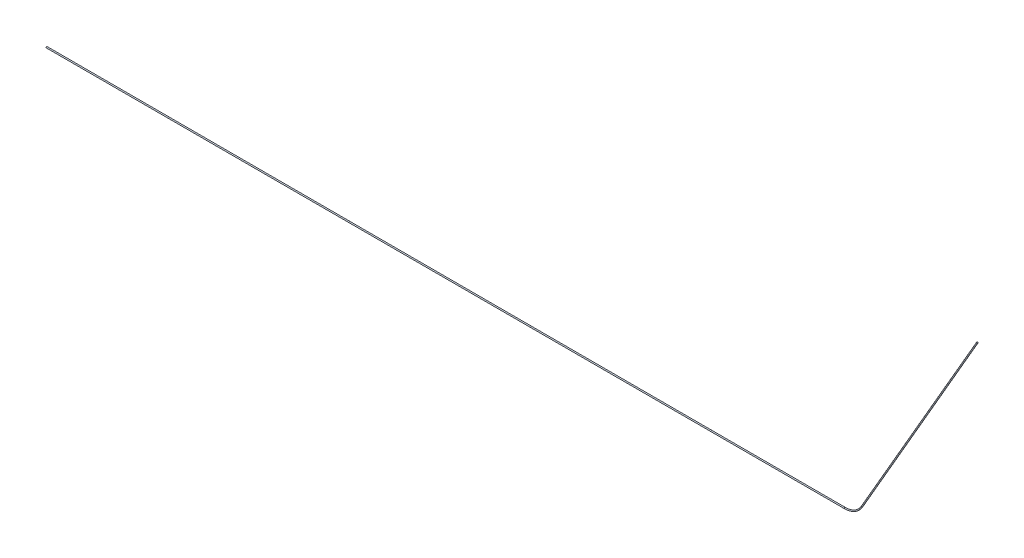
ISO-10303-21;
HEADER;
FILE_DESCRIPTION(('STEP AP214'),'2;1');
FILE_NAME('part.step','',(''),(''),'','','');
FILE_SCHEMA(('AUTOMOTIVE_DESIGN { 1 0 10303 214 1 1 1 1 }'));
ENDSEC;
DATA;
#1=APPLICATION_CONTEXT('core data for automotive mechanical design processes');
#2=APPLICATION_PROTOCOL_DEFINITION('international standard','automotive_design',2000,#1);
#3=PRODUCT_CONTEXT('',#1,'mechanical');
#4=PRODUCT('Part','Part','',(#3));
#5=PRODUCT_RELATED_PRODUCT_CATEGORY('part','',(#4));
#6=PRODUCT_DEFINITION_FORMATION('','',#4);
#7=PRODUCT_DEFINITION_CONTEXT('part definition',#1,'design');
#8=PRODUCT_DEFINITION('design','',#6,#7);
#9=PRODUCT_DEFINITION_SHAPE('','',#8);
#10=(LENGTH_UNIT() NAMED_UNIT(*) SI_UNIT(.MILLI.,.METRE.));
#11=(NAMED_UNIT(*) PLANE_ANGLE_UNIT() SI_UNIT($,.RADIAN.));
#12=(NAMED_UNIT(*) SI_UNIT($,.STERADIAN.) SOLID_ANGLE_UNIT());
#13=UNCERTAINTY_MEASURE_WITH_UNIT(LENGTH_MEASURE(1.E-05),#10,'distance_accuracy_value','');
#14=(GEOMETRIC_REPRESENTATION_CONTEXT(3) GLOBAL_UNCERTAINTY_ASSIGNED_CONTEXT((#13)) GLOBAL_UNIT_ASSIGNED_CONTEXT((#10,
#11,#12)) REPRESENTATION_CONTEXT('',''));
#15=CARTESIAN_POINT('',(0.,0.,0.));
#16=DIRECTION('',(0.,0.,1.));
#17=DIRECTION('',(1.,0.,0.));
#18=AXIS2_PLACEMENT_3D('',#15,#16,#17);
#19=CARTESIAN_POINT('',(0.,0.,0.));
#20=DIRECTION('',(1.,0.,0.));
#21=DIRECTION('',(0.,0.,-1.));
#22=AXIS2_PLACEMENT_3D('',#19,#20,#21);
#23=PLANE('',#22);
#24=CARTESIAN_POINT('',(0.,0.,0.));
#25=DIRECTION('',(1.,0.,0.));
#26=DIRECTION('',(0.,0.,-1.));
#27=AXIS2_PLACEMENT_3D('',#24,#25,#26);
#28=CIRCLE('',#27,0.875);
#29=CARTESIAN_POINT('',(0.,0.,-0.875));
#30=VERTEX_POINT('',#29);
#31=EDGE_CURVE('E44',#30,#30,#28,.T.);
#32=ORIENTED_EDGE('',*,*,#31,.F.);
#33=EDGE_LOOP('',(#32));
#34=FACE_BOUND('',#33,.T.);
#35=ADVANCED_FACE('F32',(#34),#23,.F.);
#36=CARTESIAN_POINT('',(1421.15712416253,319.8,0.));
#37=DIRECTION('',(0.499999999999998,0.86602540378444,0.));
#38=DIRECTION('',(0.,0.,-1.));
#39=AXIS2_PLACEMENT_3D('',#36,#37,#38);
#40=PLANE('',#39);
#41=CARTESIAN_POINT('',(1421.15712416253,319.8,0.));
#42=DIRECTION('',(0.499999999999998,0.86602540378444,0.));
#43=DIRECTION('',(0.,0.,-1.));
#44=AXIS2_PLACEMENT_3D('',#41,#42,#43);
#45=CIRCLE('',#44,0.875);
#46=CARTESIAN_POINT('',(1421.15712416253,319.8,-0.875));
#47=VERTEX_POINT('',#46);
#48=EDGE_CURVE('E11',#47,#47,#45,.T.);
#49=ORIENTED_EDGE('',*,*,#48,.T.);
#50=EDGE_LOOP('',(#49));
#51=FACE_BOUND('',#50,.T.);
#52=ADVANCED_FACE('F47',(#51),#40,.T.);
#53=CARTESIAN_POINT('',(0.,0.,0.));
#54=DIRECTION('',(1.,0.,0.));
#55=DIRECTION('',(0.,0.,-1.));
#56=AXIS2_PLACEMENT_3D('',#53,#54,#55);
#57=CYLINDRICAL_SURFACE('',#56,0.875);
#58=CARTESIAN_POINT('',(1219.2,0.,0.));
#59=DIRECTION('',(1.,0.,0.));
#60=DIRECTION('',(0.,0.,-1.));
#61=AXIS2_PLACEMENT_3D('',#58,#59,#60);
#62=CIRCLE('',#61,0.875);
#63=CARTESIAN_POINT('',(1219.2,-0.875000000000049,0.));
#64=VERTEX_POINT('',#63);
#65=EDGE_CURVE('E57',#64,#64,#62,.T.);
#66=ORIENTED_EDGE('',*,*,#65,.F.);
#67=EDGE_LOOP('',(#66));
#68=FACE_BOUND('',#67,.T.);
#69=ORIENTED_EDGE('',*,*,#31,.T.);
#70=EDGE_LOOP('',(#69));
#71=FACE_BOUND('',#70,.T.);
#72=ADVANCED_FACE('F62',(#68,#71),#57,.T.);
#73=CARTESIAN_POINT('',(1219.2,30.,0.));
#74=DIRECTION('',(0.,0.,1.));
#75=DIRECTION('',(1.,0.,0.));
#76=AXIS2_PLACEMENT_3D('',#73,#74,#75);
#77=TOROIDAL_SURFACE('',#76,30.,0.875);
#78=CARTESIAN_POINT('',(1245.18076211353,15.0000000000001,0.));
#79=DIRECTION('',(0.499999999999996,0.866025403784441,0.));
#80=DIRECTION('',(0.,0.,-1.));
#81=AXIS2_PLACEMENT_3D('',#78,#79,#80);
#82=CIRCLE('',#81,0.875);
#83=CARTESIAN_POINT('',(1245.93853434184,14.5625000000001,0.));
#84=VERTEX_POINT('',#83);
#85=EDGE_CURVE('E39',#84,#84,#82,.T.);
#86=CARTESIAN_POINT('',(1219.2,30.,0.));
#87=DIRECTION('',(0.,0.,1.));
#88=DIRECTION('',(1.,0.,0.));
#89=AXIS2_PLACEMENT_3D('',#86,#87,#88);
#90=CIRCLE('',#89,30.875);
#91=EDGE_CURVE('',#64,#84,#90,.T.);
#92=ORIENTED_EDGE('',*,*,#65,.T.);
#93=ORIENTED_EDGE('',*,*,#85,.F.);
#94=ORIENTED_EDGE('',*,*,#91,.T.);
#95=ORIENTED_EDGE('',*,*,#91,.F.);
#96=EDGE_LOOP('',(#92,#94,#93,#95));
#97=FACE_BOUND('',#96,.T.);
#98=ADVANCED_FACE('F52',(#97),#77,.T.);
#99=CARTESIAN_POINT('',(1245.18076211353,15.0000000000001,0.));
#100=DIRECTION('',(0.499999999999998,0.86602540378444,0.));
#101=DIRECTION('',(-0.86602540378444,0.499999999999998,0.));
#102=AXIS2_PLACEMENT_3D('',#99,#100,#101);
#103=CYLINDRICAL_SURFACE('',#102,0.875);
#104=ORIENTED_EDGE('',*,*,#48,.F.);
#105=EDGE_LOOP('',(#104));
#106=FACE_BOUND('',#105,.T.);
#107=ORIENTED_EDGE('',*,*,#85,.T.);
#108=EDGE_LOOP('',(#107));
#109=FACE_BOUND('',#108,.T.);
#110=ADVANCED_FACE('F49',(#106,#109),#103,.T.);
#111=CLOSED_SHELL('',(#35,#52,#72,#98,#110));
#112=MANIFOLD_SOLID_BREP('B2',#111);
#113=ADVANCED_BREP_SHAPE_REPRESENTATION('',(#18,#112),#14);
#114=SHAPE_DEFINITION_REPRESENTATION(#9,#113);
ENDSEC;
END-ISO-10303-21;
